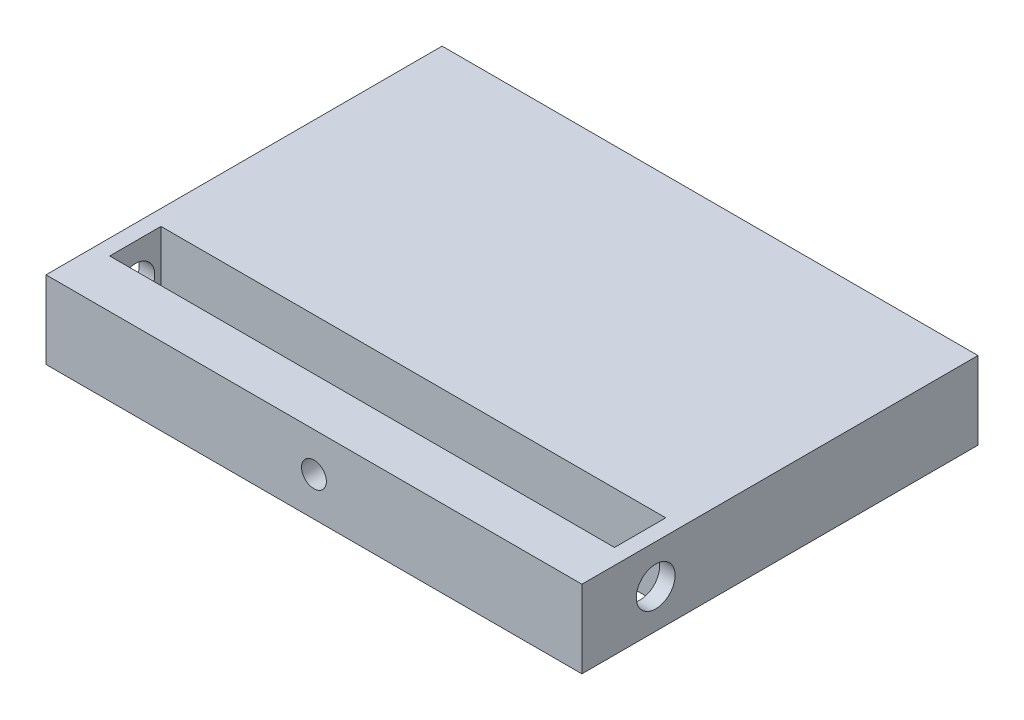
ISO-10303-21;
HEADER;
FILE_DESCRIPTION(('STEP AP214'),'2;1');
FILE_NAME('part.step','',(''),(''),'','','');
FILE_SCHEMA(('AUTOMOTIVE_DESIGN { 1 0 10303 214 1 1 1 1 }'));
ENDSEC;
DATA;
#1=APPLICATION_CONTEXT('core data for automotive mechanical design processes');
#2=APPLICATION_PROTOCOL_DEFINITION('international standard','automotive_design',2000,#1);
#3=PRODUCT_CONTEXT('',#1,'mechanical');
#4=PRODUCT('Part','Part','',(#3));
#5=PRODUCT_RELATED_PRODUCT_CATEGORY('part','',(#4));
#6=PRODUCT_DEFINITION_FORMATION('','',#4);
#7=PRODUCT_DEFINITION_CONTEXT('part definition',#1,'design');
#8=PRODUCT_DEFINITION('design','',#6,#7);
#9=PRODUCT_DEFINITION_SHAPE('','',#8);
#10=(LENGTH_UNIT() NAMED_UNIT(*) SI_UNIT(.MILLI.,.METRE.));
#11=(NAMED_UNIT(*) PLANE_ANGLE_UNIT() SI_UNIT($,.RADIAN.));
#12=(NAMED_UNIT(*) SI_UNIT($,.STERADIAN.) SOLID_ANGLE_UNIT());
#13=UNCERTAINTY_MEASURE_WITH_UNIT(LENGTH_MEASURE(1.E-05),#10,'distance_accuracy_value','');
#14=(GEOMETRIC_REPRESENTATION_CONTEXT(3) GLOBAL_UNCERTAINTY_ASSIGNED_CONTEXT((#13)) GLOBAL_UNIT_ASSIGNED_CONTEXT((#10,
#11,#12)) REPRESENTATION_CONTEXT('',''));
#15=CARTESIAN_POINT('',(0.,0.,0.));
#16=DIRECTION('',(0.,0.,1.));
#17=DIRECTION('',(1.,0.,0.));
#18=AXIS2_PLACEMENT_3D('',#15,#16,#17);
#19=CARTESIAN_POINT('',(17.25,5.,-12.75));
#20=DIRECTION('',(-1.,0.,0.));
#21=DIRECTION('',(0.,0.,1.));
#22=AXIS2_PLACEMENT_3D('',#19,#20,#21);
#23=PLANE('',#22);
#24=CARTESIAN_POINT('',(17.25,2.5,8.));
#25=DIRECTION('',(1.,0.,0.));
#26=DIRECTION('',(0.,0.,-1.));
#27=AXIS2_PLACEMENT_3D('',#24,#25,#26);
#28=CIRCLE('',#27,1.25);
#29=CARTESIAN_POINT('',(17.25,2.5,6.75));
#30=VERTEX_POINT('',#29);
#31=EDGE_CURVE('E117',#30,#30,#28,.T.);
#32=ORIENTED_EDGE('',*,*,#31,.F.);
#33=EDGE_LOOP('',(#32));
#34=FACE_BOUND('',#33,.T.);
#35=DIRECTION('',(0.,0.,-1.));
#36=VECTOR('',#35,1.);
#37=CARTESIAN_POINT('',(17.25,0.,-12.75));
#38=LINE('',#37,#36);
#39=CARTESIAN_POINT('',(17.25,0.,12.75));
#40=VERTEX_POINT('',#39);
#41=CARTESIAN_POINT('',(17.25,0.,-12.75));
#42=VERTEX_POINT('',#41);
#43=EDGE_CURVE('E156',#40,#42,#38,.T.);
#44=ORIENTED_EDGE('',*,*,#43,.T.);
#45=DIRECTION('',(0.,-1.,0.));
#46=VECTOR('',#45,1.);
#47=CARTESIAN_POINT('',(17.25,5.,-12.75));
#48=LINE('',#47,#46);
#49=CARTESIAN_POINT('',(17.25,5.,-12.75));
#50=VERTEX_POINT('',#49);
#51=EDGE_CURVE('E11',#50,#42,#48,.T.);
#52=ORIENTED_EDGE('',*,*,#51,.F.);
#53=DIRECTION('',(0.,0.,-1.));
#54=VECTOR('',#53,1.);
#55=CARTESIAN_POINT('',(17.25,5.,-12.75));
#56=LINE('',#55,#54);
#57=CARTESIAN_POINT('',(17.25,5.,12.75));
#58=VERTEX_POINT('',#57);
#59=EDGE_CURVE('E162',#58,#50,#56,.T.);
#60=ORIENTED_EDGE('',*,*,#59,.F.);
#61=DIRECTION('',(0.,-1.,0.));
#62=VECTOR('',#61,1.);
#63=CARTESIAN_POINT('',(17.25,5.,12.75));
#64=LINE('',#63,#62);
#65=EDGE_CURVE('E172',#58,#40,#64,.T.);
#66=ORIENTED_EDGE('',*,*,#65,.T.);
#67=EDGE_LOOP('',(#44,#52,#60,#66));
#68=FACE_BOUND('',#67,.T.);
#69=ADVANCED_FACE('F41',(#34,#68),#23,.F.);
#70=CARTESIAN_POINT('',(-17.25,5.,-12.75));
#71=DIRECTION('',(0.,0.,1.));
#72=DIRECTION('',(1.,0.,0.));
#73=AXIS2_PLACEMENT_3D('',#70,#71,#72);
#74=PLANE('',#73);
#75=CARTESIAN_POINT('',(0.,2.5,-12.75));
#76=DIRECTION('',(0.,0.,-1.));
#77=DIRECTION('',(-1.,0.,0.));
#78=AXIS2_PLACEMENT_3D('',#75,#76,#77);
#79=CIRCLE('',#78,0.79999999999999);
#80=CARTESIAN_POINT('',(-0.799999999999993,2.5,-12.75));
#81=VERTEX_POINT('',#80);
#82=EDGE_CURVE('E118',#81,#81,#79,.T.);
#83=ORIENTED_EDGE('',*,*,#82,.F.);
#84=EDGE_LOOP('',(#83));
#85=FACE_BOUND('',#84,.T.);
#86=DIRECTION('',(-1.,0.,0.));
#87=VECTOR('',#86,1.);
#88=CARTESIAN_POINT('',(-17.25,0.,-12.75));
#89=LINE('',#88,#87);
#90=CARTESIAN_POINT('',(-17.25,0.,-12.75));
#91=VERTEX_POINT('',#90);
#92=EDGE_CURVE('E175',#42,#91,#89,.T.);
#93=ORIENTED_EDGE('',*,*,#92,.T.);
#94=DIRECTION('',(0.,-1.,0.));
#95=VECTOR('',#94,1.);
#96=CARTESIAN_POINT('',(-17.25,5.,-12.75));
#97=LINE('',#96,#95);
#98=CARTESIAN_POINT('',(-17.25,5.,-12.75));
#99=VERTEX_POINT('',#98);
#100=EDGE_CURVE('E49',#99,#91,#97,.T.);
#101=ORIENTED_EDGE('',*,*,#100,.F.);
#102=DIRECTION('',(-1.,0.,0.));
#103=VECTOR('',#102,1.);
#104=CARTESIAN_POINT('',(-17.25,5.,-12.75));
#105=LINE('',#104,#103);
#106=EDGE_CURVE('E165',#50,#99,#105,.T.);
#107=ORIENTED_EDGE('',*,*,#106,.F.);
#108=ORIENTED_EDGE('',*,*,#51,.T.);
#109=EDGE_LOOP('',(#93,#101,#107,#108));
#110=FACE_BOUND('',#109,.T.);
#111=ADVANCED_FACE('F206',(#85,#110),#74,.F.);
#112=CARTESIAN_POINT('',(-17.25,5.,-12.75));
#113=DIRECTION('',(1.,0.,0.));
#114=DIRECTION('',(0.,0.,-1.));
#115=AXIS2_PLACEMENT_3D('',#112,#113,#114);
#116=PLANE('',#115);
#117=CARTESIAN_POINT('',(-17.25,2.5,8.00000000000002));
#118=DIRECTION('',(1.,0.,0.));
#119=DIRECTION('',(0.,0.,-1.));
#120=AXIS2_PLACEMENT_3D('',#117,#118,#119);
#121=CIRCLE('',#120,1.25);
#122=CARTESIAN_POINT('',(-17.25,2.5,6.75000000000002));
#123=VERTEX_POINT('',#122);
#124=EDGE_CURVE('E121',#123,#123,#121,.T.);
#125=ORIENTED_EDGE('',*,*,#124,.T.);
#126=EDGE_LOOP('',(#125));
#127=FACE_BOUND('',#126,.T.);
#128=DIRECTION('',(0.,0.,1.));
#129=VECTOR('',#128,1.);
#130=CARTESIAN_POINT('',(-17.25,0.,-12.75));
#131=LINE('',#130,#129);
#132=CARTESIAN_POINT('',(-17.25,0.,12.75));
#133=VERTEX_POINT('',#132);
#134=EDGE_CURVE('E177',#91,#133,#131,.T.);
#135=ORIENTED_EDGE('',*,*,#134,.T.);
#136=DIRECTION('',(0.,-1.,0.));
#137=VECTOR('',#136,1.);
#138=CARTESIAN_POINT('',(-17.25,5.,12.75));
#139=LINE('',#138,#137);
#140=CARTESIAN_POINT('',(-17.25,5.,12.75));
#141=VERTEX_POINT('',#140);
#142=EDGE_CURVE('E182',#141,#133,#139,.T.);
#143=ORIENTED_EDGE('',*,*,#142,.F.);
#144=DIRECTION('',(0.,0.,1.));
#145=VECTOR('',#144,1.);
#146=CARTESIAN_POINT('',(-17.25,5.,-12.75));
#147=LINE('',#146,#145);
#148=EDGE_CURVE('E168',#99,#141,#147,.T.);
#149=ORIENTED_EDGE('',*,*,#148,.F.);
#150=ORIENTED_EDGE('',*,*,#100,.T.);
#151=EDGE_LOOP('',(#135,#143,#149,#150));
#152=FACE_BOUND('',#151,.T.);
#153=ADVANCED_FACE('F190',(#127,#152),#116,.F.);
#154=CARTESIAN_POINT('',(-17.25,5.,12.75));
#155=DIRECTION('',(0.,0.,-1.));
#156=DIRECTION('',(-1.,0.,0.));
#157=AXIS2_PLACEMENT_3D('',#154,#155,#156);
#158=PLANE('',#157);
#159=CARTESIAN_POINT('',(0.,2.5,12.75));
#160=DIRECTION('',(0.,0.,1.));
#161=DIRECTION('',(1.,0.,0.));
#162=AXIS2_PLACEMENT_3D('',#159,#160,#161);
#163=CIRCLE('',#162,0.79999999999999);
#164=CARTESIAN_POINT('',(0.799999999999986,2.5,12.75));
#165=VERTEX_POINT('',#164);
#166=EDGE_CURVE('E257',#165,#165,#163,.T.);
#167=ORIENTED_EDGE('',*,*,#166,.F.);
#168=EDGE_LOOP('',(#167));
#169=FACE_BOUND('',#168,.T.);
#170=DIRECTION('',(1.,0.,0.));
#171=VECTOR('',#170,1.);
#172=CARTESIAN_POINT('',(-17.25,0.,12.75));
#173=LINE('',#172,#171);
#174=EDGE_CURVE('E166',#133,#40,#173,.T.);
#175=ORIENTED_EDGE('',*,*,#174,.T.);
#176=ORIENTED_EDGE('',*,*,#65,.F.);
#177=DIRECTION('',(1.,0.,0.));
#178=VECTOR('',#177,1.);
#179=CARTESIAN_POINT('',(-17.25,5.,12.75));
#180=LINE('',#179,#178);
#181=EDGE_CURVE('E170',#141,#58,#180,.T.);
#182=ORIENTED_EDGE('',*,*,#181,.F.);
#183=ORIENTED_EDGE('',*,*,#142,.T.);
#184=EDGE_LOOP('',(#175,#176,#182,#183));
#185=FACE_BOUND('',#184,.T.);
#186=ADVANCED_FACE('F199',(#169,#185),#158,.F.);
#187=CARTESIAN_POINT('',(0.,5.,0.));
#188=DIRECTION('',(0.,1.,0.));
#189=DIRECTION('',(0.,0.,1.));
#190=AXIS2_PLACEMENT_3D('',#187,#188,#189);
#191=PLANE('',#190);
#192=DIRECTION('',(0.,0.,1.));
#193=VECTOR('',#192,1.);
#194=CARTESIAN_POINT('',(16.25,5.,6.35));
#195=LINE('',#194,#193);
#196=CARTESIAN_POINT('',(16.25,5.,6.35));
#197=VERTEX_POINT('',#196);
#198=CARTESIAN_POINT('',(16.25,5.,9.65));
#199=VERTEX_POINT('',#198);
#200=EDGE_CURVE('E133',#197,#199,#195,.T.);
#201=ORIENTED_EDGE('',*,*,#200,.T.);
#202=DIRECTION('',(-1.,0.,0.));
#203=VECTOR('',#202,1.);
#204=CARTESIAN_POINT('',(-16.25,5.,9.65));
#205=LINE('',#204,#203);
#206=CARTESIAN_POINT('',(-16.25,5.,9.65));
#207=VERTEX_POINT('',#206);
#208=EDGE_CURVE('E136',#199,#207,#205,.T.);
#209=ORIENTED_EDGE('',*,*,#208,.T.);
#210=DIRECTION('',(0.,0.,-1.));
#211=VECTOR('',#210,1.);
#212=CARTESIAN_POINT('',(-16.25,5.,6.35));
#213=LINE('',#212,#211);
#214=CARTESIAN_POINT('',(-16.25,5.,6.35));
#215=VERTEX_POINT('',#214);
#216=EDGE_CURVE('E56',#207,#215,#213,.T.);
#217=ORIENTED_EDGE('',*,*,#216,.T.);
#218=DIRECTION('',(1.,0.,0.));
#219=VECTOR('',#218,1.);
#220=CARTESIAN_POINT('',(-16.25,5.,6.35));
#221=LINE('',#220,#219);
#222=EDGE_CURVE('E141',#215,#197,#221,.T.);
#223=ORIENTED_EDGE('',*,*,#222,.T.);
#224=EDGE_LOOP('',(#201,#209,#217,#223));
#225=FACE_BOUND('',#224,.T.);
#226=ORIENTED_EDGE('',*,*,#59,.T.);
#227=ORIENTED_EDGE('',*,*,#106,.T.);
#228=ORIENTED_EDGE('',*,*,#148,.T.);
#229=ORIENTED_EDGE('',*,*,#181,.T.);
#230=EDGE_LOOP('',(#226,#227,#228,#229));
#231=FACE_BOUND('',#230,.T.);
#232=ADVANCED_FACE('F205',(#225,#231),#191,.T.);
#233=CARTESIAN_POINT('',(0.,0.,0.));
#234=DIRECTION('',(0.,1.,0.));
#235=DIRECTION('',(0.,0.,1.));
#236=AXIS2_PLACEMENT_3D('',#233,#234,#235);
#237=PLANE('',#236);
#238=DIRECTION('',(-1.,0.,0.));
#239=VECTOR('',#238,1.);
#240=CARTESIAN_POINT('',(-16.25,0.,9.65));
#241=LINE('',#240,#239);
#242=CARTESIAN_POINT('',(16.25,0.,9.65));
#243=VERTEX_POINT('',#242);
#244=CARTESIAN_POINT('',(-16.25,0.,9.65));
#245=VERTEX_POINT('',#244);
#246=EDGE_CURVE('E146',#243,#245,#241,.T.);
#247=ORIENTED_EDGE('',*,*,#246,.F.);
#248=DIRECTION('',(0.,0.,1.));
#249=VECTOR('',#248,1.);
#250=CARTESIAN_POINT('',(16.25,0.,6.35));
#251=LINE('',#250,#249);
#252=CARTESIAN_POINT('',(16.25,0.,6.35));
#253=VERTEX_POINT('',#252);
#254=EDGE_CURVE('E64',#253,#243,#251,.T.);
#255=ORIENTED_EDGE('',*,*,#254,.F.);
#256=DIRECTION('',(1.,0.,0.));
#257=VECTOR('',#256,1.);
#258=CARTESIAN_POINT('',(-16.25,0.,6.35));
#259=LINE('',#258,#257);
#260=CARTESIAN_POINT('',(-16.25,0.,6.35));
#261=VERTEX_POINT('',#260);
#262=EDGE_CURVE('E137',#261,#253,#259,.T.);
#263=ORIENTED_EDGE('',*,*,#262,.F.);
#264=DIRECTION('',(0.,0.,-1.));
#265=VECTOR('',#264,1.);
#266=CARTESIAN_POINT('',(-16.25,0.,6.35));
#267=LINE('',#266,#265);
#268=EDGE_CURVE('E149',#245,#261,#267,.T.);
#269=ORIENTED_EDGE('',*,*,#268,.F.);
#270=EDGE_LOOP('',(#247,#255,#263,#269));
#271=FACE_BOUND('',#270,.T.);
#272=ORIENTED_EDGE('',*,*,#43,.F.);
#273=ORIENTED_EDGE('',*,*,#174,.F.);
#274=ORIENTED_EDGE('',*,*,#134,.F.);
#275=ORIENTED_EDGE('',*,*,#92,.F.);
#276=EDGE_LOOP('',(#272,#273,#274,#275));
#277=FACE_BOUND('',#276,.T.);
#278=ADVANCED_FACE('F196',(#271,#277),#237,.F.);
#279=CARTESIAN_POINT('',(16.25,5.,6.35));
#280=DIRECTION('',(1.,0.,0.));
#281=DIRECTION('',(0.,0.,-1.));
#282=AXIS2_PLACEMENT_3D('',#279,#280,#281);
#283=PLANE('',#282);
#284=CARTESIAN_POINT('',(16.25,2.5,8.));
#285=DIRECTION('',(1.,0.,0.));
#286=DIRECTION('',(0.,0.,-1.));
#287=AXIS2_PLACEMENT_3D('',#284,#285,#286);
#288=CIRCLE('',#287,1.25);
#289=CARTESIAN_POINT('',(16.25,2.5,6.75));
#290=VERTEX_POINT('',#289);
#291=EDGE_CURVE('E130',#290,#290,#288,.T.);
#292=ORIENTED_EDGE('',*,*,#291,.T.);
#293=EDGE_LOOP('',(#292));
#294=FACE_BOUND('',#293,.T.);
#295=ORIENTED_EDGE('',*,*,#254,.T.);
#296=DIRECTION('',(0.,-1.,0.));
#297=VECTOR('',#296,1.);
#298=CARTESIAN_POINT('',(16.25,5.,9.65));
#299=LINE('',#298,#297);
#300=EDGE_CURVE('E144',#199,#243,#299,.T.);
#301=ORIENTED_EDGE('',*,*,#300,.F.);
#302=ORIENTED_EDGE('',*,*,#200,.F.);
#303=DIRECTION('',(0.,-1.,0.));
#304=VECTOR('',#303,1.);
#305=CARTESIAN_POINT('',(16.25,5.,6.35));
#306=LINE('',#305,#304);
#307=EDGE_CURVE('E154',#197,#253,#306,.T.);
#308=ORIENTED_EDGE('',*,*,#307,.T.);
#309=EDGE_LOOP('',(#295,#301,#302,#308));
#310=FACE_BOUND('',#309,.T.);
#311=ADVANCED_FACE('F223',(#294,#310),#283,.F.);
#312=CARTESIAN_POINT('',(-16.25,5.,6.35));
#313=DIRECTION('',(0.,0.,-1.));
#314=DIRECTION('',(-1.,0.,0.));
#315=AXIS2_PLACEMENT_3D('',#312,#313,#314);
#316=PLANE('',#315);
#317=ORIENTED_EDGE('',*,*,#262,.T.);
#318=ORIENTED_EDGE('',*,*,#307,.F.);
#319=ORIENTED_EDGE('',*,*,#222,.F.);
#320=DIRECTION('',(0.,-1.,0.));
#321=VECTOR('',#320,1.);
#322=CARTESIAN_POINT('',(-16.25,5.,6.35));
#323=LINE('',#322,#321);
#324=EDGE_CURVE('E157',#215,#261,#323,.T.);
#325=ORIENTED_EDGE('',*,*,#324,.T.);
#326=EDGE_LOOP('',(#317,#318,#319,#325));
#327=FACE_BOUND('',#326,.T.);
#328=ADVANCED_FACE('F230',(#327),#316,.F.);
#329=CARTESIAN_POINT('',(-16.25,5.,6.35));
#330=DIRECTION('',(-1.,0.,0.));
#331=DIRECTION('',(0.,0.,1.));
#332=AXIS2_PLACEMENT_3D('',#329,#330,#331);
#333=PLANE('',#332);
#334=CARTESIAN_POINT('',(-16.25,2.5,8.00000000000002));
#335=DIRECTION('',(-1.,0.,0.));
#336=DIRECTION('',(0.,0.,1.));
#337=AXIS2_PLACEMENT_3D('',#334,#335,#336);
#338=CIRCLE('',#337,1.25);
#339=CARTESIAN_POINT('',(-16.25,2.5,9.25000000000002));
#340=VERTEX_POINT('',#339);
#341=EDGE_CURVE('E44',#340,#340,#338,.T.);
#342=ORIENTED_EDGE('',*,*,#341,.T.);
#343=EDGE_LOOP('',(#342));
#344=FACE_BOUND('',#343,.T.);
#345=ORIENTED_EDGE('',*,*,#268,.T.);
#346=ORIENTED_EDGE('',*,*,#324,.F.);
#347=ORIENTED_EDGE('',*,*,#216,.F.);
#348=DIRECTION('',(0.,-1.,0.));
#349=VECTOR('',#348,1.);
#350=CARTESIAN_POINT('',(-16.25,5.,9.65));
#351=LINE('',#350,#349);
#352=EDGE_CURVE('E159',#207,#245,#351,.T.);
#353=ORIENTED_EDGE('',*,*,#352,.T.);
#354=EDGE_LOOP('',(#345,#346,#347,#353));
#355=FACE_BOUND('',#354,.T.);
#356=ADVANCED_FACE('F236',(#344,#355),#333,.F.);
#357=CARTESIAN_POINT('',(-16.25,5.,9.65));
#358=DIRECTION('',(0.,0.,1.));
#359=DIRECTION('',(1.,0.,0.));
#360=AXIS2_PLACEMENT_3D('',#357,#358,#359);
#361=PLANE('',#360);
#362=CARTESIAN_POINT('',(0.,2.5,9.65));
#363=DIRECTION('',(0.,0.,1.));
#364=DIRECTION('',(1.,0.,0.));
#365=AXIS2_PLACEMENT_3D('',#362,#363,#364);
#366=CIRCLE('',#365,0.799999999999989);
#367=CARTESIAN_POINT('',(0.799999999999985,2.5,9.65));
#368=VERTEX_POINT('',#367);
#369=EDGE_CURVE('E124',#368,#368,#366,.T.);
#370=ORIENTED_EDGE('',*,*,#369,.T.);
#371=EDGE_LOOP('',(#370));
#372=FACE_BOUND('',#371,.T.);
#373=ORIENTED_EDGE('',*,*,#246,.T.);
#374=ORIENTED_EDGE('',*,*,#352,.F.);
#375=ORIENTED_EDGE('',*,*,#208,.F.);
#376=ORIENTED_EDGE('',*,*,#300,.T.);
#377=EDGE_LOOP('',(#373,#374,#375,#376));
#378=FACE_BOUND('',#377,.T.);
#379=ADVANCED_FACE('F232',(#372,#378),#361,.F.);
#380=CARTESIAN_POINT('',(-17.25,2.5,8.00000000000002));
#381=DIRECTION('',(1.,0.,0.));
#382=DIRECTION('',(0.,0.,-1.));
#383=AXIS2_PLACEMENT_3D('',#380,#381,#382);
#384=CYLINDRICAL_SURFACE('',#383,1.25);
#385=ORIENTED_EDGE('',*,*,#124,.F.);
#386=EDGE_LOOP('',(#385));
#387=FACE_BOUND('',#386,.T.);
#388=ORIENTED_EDGE('',*,*,#341,.F.);
#389=EDGE_LOOP('',(#388));
#390=FACE_BOUND('',#389,.T.);
#391=ADVANCED_FACE('F235',(#387,#390),#384,.F.);
#392=ORIENTED_EDGE('',*,*,#31,.T.);
#393=EDGE_LOOP('',(#392));
#394=FACE_BOUND('',#393,.T.);
#395=ORIENTED_EDGE('',*,*,#291,.F.);
#396=EDGE_LOOP('',(#395));
#397=FACE_BOUND('',#396,.T.);
#398=ADVANCED_FACE('F111',(#394,#397),#384,.F.);
#399=CARTESIAN_POINT('',(0.,2.5,-7.55));
#400=DIRECTION('',(0.,0.,-1.));
#401=DIRECTION('',(-1.,0.,0.));
#402=AXIS2_PLACEMENT_3D('',#399,#400,#401);
#403=CONICAL_SURFACE('',#402,0.799999999999988,1.02974425867664);
#404=CARTESIAN_POINT('',(0.,2.5,-7.06931150477795));
#405=VERTEX_POINT('',#404);
#406=VERTEX_LOOP('',#405);
#407=FACE_BOUND('',#406,.T.);
#408=CARTESIAN_POINT('',(0.,2.5,-7.55));
#409=DIRECTION('',(0.,0.,-1.));
#410=DIRECTION('',(-1.,0.,0.));
#411=AXIS2_PLACEMENT_3D('',#408,#409,#410);
#412=CIRCLE('',#411,0.799999999999988);
#413=CARTESIAN_POINT('',(-0.799999999999991,2.5,-7.55));
#414=VERTEX_POINT('',#413);
#415=EDGE_CURVE('E115',#414,#414,#412,.T.);
#416=ORIENTED_EDGE('',*,*,#415,.T.);
#417=EDGE_LOOP('',(#416));
#418=FACE_BOUND('',#417,.T.);
#419=ADVANCED_FACE('F107',(#407,#418),#403,.F.);
#420=CARTESIAN_POINT('',(0.,2.5,-12.75));
#421=DIRECTION('',(0.,0.,-1.));
#422=DIRECTION('',(-1.,0.,0.));
#423=AXIS2_PLACEMENT_3D('',#420,#421,#422);
#424=CYLINDRICAL_SURFACE('',#423,0.799999999999989);
#425=ORIENTED_EDGE('',*,*,#415,.F.);
#426=EDGE_LOOP('',(#425));
#427=FACE_BOUND('',#426,.T.);
#428=ORIENTED_EDGE('',*,*,#82,.T.);
#429=EDGE_LOOP('',(#428));
#430=FACE_BOUND('',#429,.T.);
#431=ADVANCED_FACE('F110',(#427,#430),#424,.F.);
#432=CARTESIAN_POINT('',(0.,2.5,12.75));
#433=DIRECTION('',(0.,0.,1.));
#434=DIRECTION('',(1.,0.,0.));
#435=AXIS2_PLACEMENT_3D('',#432,#433,#434);
#436=CYLINDRICAL_SURFACE('',#435,0.799999999999989);
#437=ORIENTED_EDGE('',*,*,#166,.T.);
#438=EDGE_LOOP('',(#437));
#439=FACE_BOUND('',#438,.T.);
#440=ORIENTED_EDGE('',*,*,#369,.F.);
#441=EDGE_LOOP('',(#440));
#442=FACE_BOUND('',#441,.T.);
#443=ADVANCED_FACE('F249',(#439,#442),#436,.F.);
#444=CLOSED_SHELL('',(#69,#111,#153,#186,#232,#278,#311,#328,#356,#379,#391,#398,#419,#431,#443));
#445=MANIFOLD_SOLID_BREP('B2',#444);
#446=ADVANCED_BREP_SHAPE_REPRESENTATION('',(#18,#445),#14);
#447=SHAPE_DEFINITION_REPRESENTATION(#9,#446);
ENDSEC;
END-ISO-10303-21;
